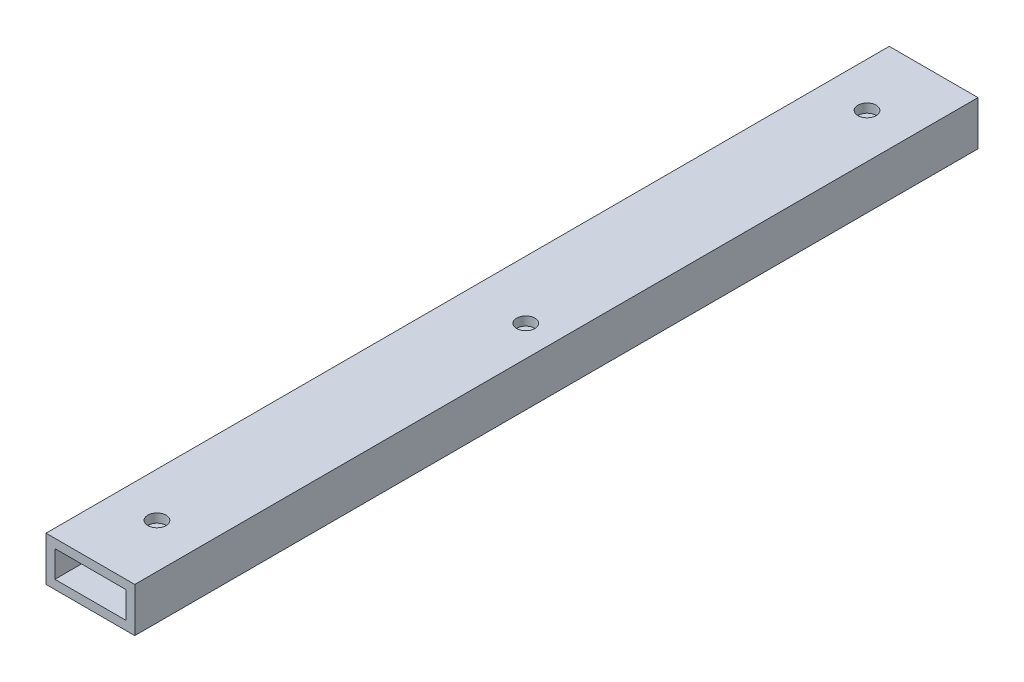
ISO-10303-21;
HEADER;
FILE_DESCRIPTION(('STEP AP214'),'2;1');
FILE_NAME('part.step','',(''),(''),'','','');
FILE_SCHEMA(('AUTOMOTIVE_DESIGN { 1 0 10303 214 1 1 1 1 }'));
ENDSEC;
DATA;
#1=APPLICATION_CONTEXT('core data for automotive mechanical design processes');
#2=APPLICATION_PROTOCOL_DEFINITION('international standard','automotive_design',2000,#1);
#3=PRODUCT_CONTEXT('',#1,'mechanical');
#4=PRODUCT('Part','Part','',(#3));
#5=PRODUCT_RELATED_PRODUCT_CATEGORY('part','',(#4));
#6=PRODUCT_DEFINITION_FORMATION('','',#4);
#7=PRODUCT_DEFINITION_CONTEXT('part definition',#1,'design');
#8=PRODUCT_DEFINITION('design','',#6,#7);
#9=PRODUCT_DEFINITION_SHAPE('','',#8);
#10=(LENGTH_UNIT() NAMED_UNIT(*) SI_UNIT(.MILLI.,.METRE.));
#11=(NAMED_UNIT(*) PLANE_ANGLE_UNIT() SI_UNIT($,.RADIAN.));
#12=(NAMED_UNIT(*) SI_UNIT($,.STERADIAN.) SOLID_ANGLE_UNIT());
#13=UNCERTAINTY_MEASURE_WITH_UNIT(LENGTH_MEASURE(1.E-05),#10,'distance_accuracy_value','');
#14=(GEOMETRIC_REPRESENTATION_CONTEXT(3) GLOBAL_UNCERTAINTY_ASSIGNED_CONTEXT((#13)) GLOBAL_UNIT_ASSIGNED_CONTEXT((#10,
#11,#12)) REPRESENTATION_CONTEXT('',''));
#15=CARTESIAN_POINT('',(0.,0.,0.));
#16=DIRECTION('',(0.,0.,1.));
#17=DIRECTION('',(1.,0.,0.));
#18=AXIS2_PLACEMENT_3D('',#15,#16,#17);
#19=CARTESIAN_POINT('',(0.,0.,95.));
#20=DIRECTION('',(0.,0.,1.));
#21=DIRECTION('',(1.,0.,0.));
#22=AXIS2_PLACEMENT_3D('',#19,#20,#21);
#23=PLANE('',#22);
#24=DIRECTION('',(0.,1.,0.));
#25=VECTOR('',#24,1.);
#26=CARTESIAN_POINT('',(10.0367537285158,5.03823934953629,95.));
#27=LINE('',#26,#25);
#28=CARTESIAN_POINT('',(10.0367537285158,-4.96176065046371,95.));
#29=VERTEX_POINT('',#28);
#30=CARTESIAN_POINT('',(10.0367537285158,5.03823934953629,95.));
#31=VERTEX_POINT('',#30);
#32=EDGE_CURVE('E146',#29,#31,#27,.T.);
#33=ORIENTED_EDGE('',*,*,#32,.T.);
#34=DIRECTION('',(-1.,0.,0.));
#35=VECTOR('',#34,1.);
#36=CARTESIAN_POINT('',(-9.96324627148418,5.03823934953629,95.));
#37=LINE('',#36,#35);
#38=CARTESIAN_POINT('',(-9.96324627148418,5.03823934953629,95.));
#39=VERTEX_POINT('',#38);
#40=EDGE_CURVE('E149',#31,#39,#37,.T.);
#41=ORIENTED_EDGE('',*,*,#40,.T.);
#42=DIRECTION('',(0.,-1.,0.));
#43=VECTOR('',#42,1.);
#44=CARTESIAN_POINT('',(-9.96324627148418,5.03823934953629,95.));
#45=LINE('',#44,#43);
#46=CARTESIAN_POINT('',(-9.96324627148418,-4.96176065046371,95.));
#47=VERTEX_POINT('',#46);
#48=EDGE_CURVE('E152',#39,#47,#45,.T.);
#49=ORIENTED_EDGE('',*,*,#48,.T.);
#50=DIRECTION('',(1.,0.,0.));
#51=VECTOR('',#50,1.);
#52=CARTESIAN_POINT('',(-9.96324627148418,-4.96176065046371,95.));
#53=LINE('',#52,#51);
#54=EDGE_CURVE('E154',#47,#29,#53,.T.);
#55=ORIENTED_EDGE('',*,*,#54,.T.);
#56=EDGE_LOOP('',(#33,#41,#49,#55));
#57=FACE_BOUND('',#56,.T.);
#58=DIRECTION('',(-1.,0.,0.));
#59=VECTOR('',#58,1.);
#60=CARTESIAN_POINT('',(-7.96324627148418,3.03823934953629,95.));
#61=LINE('',#60,#59);
#62=CARTESIAN_POINT('',(8.03675372851582,3.03823934953629,95.));
#63=VERTEX_POINT('',#62);
#64=CARTESIAN_POINT('',(-7.96324627148418,3.03823934953629,95.));
#65=VERTEX_POINT('',#64);
#66=EDGE_CURVE('E116',#63,#65,#61,.T.);
#67=ORIENTED_EDGE('',*,*,#66,.F.);
#68=DIRECTION('',(0.,1.,0.));
#69=VECTOR('',#68,1.);
#70=CARTESIAN_POINT('',(8.03675372851582,3.03823934953629,95.));
#71=LINE('',#70,#69);
#72=CARTESIAN_POINT('',(8.03675372851582,-2.96176065046371,95.));
#73=VERTEX_POINT('',#72);
#74=EDGE_CURVE('E108',#73,#63,#71,.T.);
#75=ORIENTED_EDGE('',*,*,#74,.F.);
#76=DIRECTION('',(1.,0.,0.));
#77=VECTOR('',#76,1.);
#78=CARTESIAN_POINT('',(-7.96324627148418,-2.96176065046371,95.));
#79=LINE('',#78,#77);
#80=CARTESIAN_POINT('',(-7.96324627148418,-2.96176065046371,95.));
#81=VERTEX_POINT('',#80);
#82=EDGE_CURVE('E130',#81,#73,#79,.T.);
#83=ORIENTED_EDGE('',*,*,#82,.F.);
#84=DIRECTION('',(0.,-1.,0.));
#85=VECTOR('',#84,1.);
#86=CARTESIAN_POINT('',(-7.96324627148418,3.03823934953629,95.));
#87=LINE('',#86,#85);
#88=EDGE_CURVE('E128',#65,#81,#87,.T.);
#89=ORIENTED_EDGE('',*,*,#88,.F.);
#90=EDGE_LOOP('',(#67,#75,#83,#89));
#91=FACE_BOUND('',#90,.T.);
#92=ADVANCED_FACE('F41',(#57,#91),#23,.T.);
#93=CARTESIAN_POINT('',(0.,0.,-95.));
#94=DIRECTION('',(0.,0.,1.));
#95=DIRECTION('',(1.,0.,0.));
#96=AXIS2_PLACEMENT_3D('',#93,#94,#95);
#97=PLANE('',#96);
#98=DIRECTION('',(0.,1.,0.));
#99=VECTOR('',#98,1.);
#100=CARTESIAN_POINT('',(10.0367537285158,5.03823934953629,-95.));
#101=LINE('',#100,#99);
#102=CARTESIAN_POINT('',(10.0367537285158,-4.96176065046371,-95.));
#103=VERTEX_POINT('',#102);
#104=CARTESIAN_POINT('',(10.0367537285158,5.03823934953629,-95.));
#105=VERTEX_POINT('',#104);
#106=EDGE_CURVE('E124',#103,#105,#101,.T.);
#107=ORIENTED_EDGE('',*,*,#106,.F.);
#108=DIRECTION('',(1.,0.,0.));
#109=VECTOR('',#108,1.);
#110=CARTESIAN_POINT('',(-9.96324627148418,-4.96176065046371,-95.));
#111=LINE('',#110,#109);
#112=CARTESIAN_POINT('',(-9.96324627148418,-4.96176065046371,-95.));
#113=VERTEX_POINT('',#112);
#114=EDGE_CURVE('E150',#113,#103,#111,.T.);
#115=ORIENTED_EDGE('',*,*,#114,.F.);
#116=DIRECTION('',(0.,-1.,0.));
#117=VECTOR('',#116,1.);
#118=CARTESIAN_POINT('',(-9.96324627148418,5.03823934953629,-95.));
#119=LINE('',#118,#117);
#120=CARTESIAN_POINT('',(-9.96324627148418,5.03823934953629,-95.));
#121=VERTEX_POINT('',#120);
#122=EDGE_CURVE('E161',#121,#113,#119,.T.);
#123=ORIENTED_EDGE('',*,*,#122,.F.);
#124=DIRECTION('',(-1.,0.,0.));
#125=VECTOR('',#124,1.);
#126=CARTESIAN_POINT('',(-9.96324627148418,5.03823934953629,-95.));
#127=LINE('',#126,#125);
#128=EDGE_CURVE('E159',#105,#121,#127,.T.);
#129=ORIENTED_EDGE('',*,*,#128,.F.);
#130=EDGE_LOOP('',(#107,#115,#123,#129));
#131=FACE_BOUND('',#130,.T.);
#132=DIRECTION('',(0.,1.,0.));
#133=VECTOR('',#132,1.);
#134=CARTESIAN_POINT('',(8.03675372851582,3.03823934953629,-95.));
#135=LINE('',#134,#133);
#136=CARTESIAN_POINT('',(8.03675372851582,-2.96176065046371,-95.));
#137=VERTEX_POINT('',#136);
#138=CARTESIAN_POINT('',(8.03675372851582,3.03823934953629,-95.));
#139=VERTEX_POINT('',#138);
#140=EDGE_CURVE('E66',#137,#139,#135,.T.);
#141=ORIENTED_EDGE('',*,*,#140,.T.);
#142=DIRECTION('',(-1.,0.,0.));
#143=VECTOR('',#142,1.);
#144=CARTESIAN_POINT('',(-7.96324627148418,3.03823934953629,-95.));
#145=LINE('',#144,#143);
#146=CARTESIAN_POINT('',(-7.96324627148418,3.03823934953629,-95.));
#147=VERTEX_POINT('',#146);
#148=EDGE_CURVE('E123',#139,#147,#145,.T.);
#149=ORIENTED_EDGE('',*,*,#148,.T.);
#150=DIRECTION('',(0.,-1.,0.));
#151=VECTOR('',#150,1.);
#152=CARTESIAN_POINT('',(-7.96324627148418,3.03823934953629,-95.));
#153=LINE('',#152,#151);
#154=CARTESIAN_POINT('',(-7.96324627148418,-2.96176065046371,-95.));
#155=VERTEX_POINT('',#154);
#156=EDGE_CURVE('E138',#147,#155,#153,.T.);
#157=ORIENTED_EDGE('',*,*,#156,.T.);
#158=DIRECTION('',(1.,0.,0.));
#159=VECTOR('',#158,1.);
#160=CARTESIAN_POINT('',(-7.96324627148418,-2.96176065046371,-95.));
#161=LINE('',#160,#159);
#162=EDGE_CURVE('E117',#155,#137,#161,.T.);
#163=ORIENTED_EDGE('',*,*,#162,.T.);
#164=EDGE_LOOP('',(#141,#149,#157,#163));
#165=FACE_BOUND('',#164,.T.);
#166=ADVANCED_FACE('F208',(#131,#165),#97,.F.);
#167=CARTESIAN_POINT('',(10.0367537285158,5.03823934953629,95.));
#168=DIRECTION('',(-1.,0.,0.));
#169=DIRECTION('',(0.,0.,1.));
#170=AXIS2_PLACEMENT_3D('',#167,#168,#169);
#171=PLANE('',#170);
#172=ORIENTED_EDGE('',*,*,#106,.T.);
#173=DIRECTION('',(0.,0.,-1.));
#174=VECTOR('',#173,1.);
#175=CARTESIAN_POINT('',(10.0367537285158,5.03823934953629,95.));
#176=LINE('',#175,#174);
#177=EDGE_CURVE('E11',#31,#105,#176,.T.);
#178=ORIENTED_EDGE('',*,*,#177,.F.);
#179=ORIENTED_EDGE('',*,*,#32,.F.);
#180=DIRECTION('',(0.,0.,-1.));
#181=VECTOR('',#180,1.);
#182=CARTESIAN_POINT('',(10.0367537285158,-4.96176065046371,95.));
#183=LINE('',#182,#181);
#184=EDGE_CURVE('E156',#29,#103,#183,.T.);
#185=ORIENTED_EDGE('',*,*,#184,.T.);
#186=EDGE_LOOP('',(#172,#178,#179,#185));
#187=FACE_BOUND('',#186,.T.);
#188=ADVANCED_FACE('F43',(#187),#171,.F.);
#189=CARTESIAN_POINT('',(-9.96324627148418,5.03823934953629,95.));
#190=DIRECTION('',(0.,-1.,0.));
#191=DIRECTION('',(0.,0.,-1.));
#192=AXIS2_PLACEMENT_3D('',#189,#190,#191);
#193=PLANE('',#192);
#194=CARTESIAN_POINT('',(0.0367537285158176,5.03823934953629,80.));
#195=DIRECTION('',(0.,1.,0.));
#196=DIRECTION('',(0.,0.,-1.));
#197=AXIS2_PLACEMENT_3D('',#194,#195,#196);
#198=CIRCLE('',#197,2.05);
#199=CARTESIAN_POINT('',(0.0367537285158176,5.03823934953629,77.95));
#200=VERTEX_POINT('',#199);
#201=EDGE_CURVE('E245',#200,#200,#198,.T.);
#202=ORIENTED_EDGE('',*,*,#201,.F.);
#203=EDGE_LOOP('',(#202));
#204=FACE_BOUND('',#203,.T.);
#205=CARTESIAN_POINT('',(0.0367537285158176,5.03823934953629,-80.));
#206=DIRECTION('',(0.,1.,0.));
#207=DIRECTION('',(0.,0.,1.));
#208=AXIS2_PLACEMENT_3D('',#205,#206,#207);
#209=CIRCLE('',#208,2.05);
#210=CARTESIAN_POINT('',(0.0367537285158176,5.03823934953629,-77.95));
#211=VERTEX_POINT('',#210);
#212=EDGE_CURVE('E249',#211,#211,#209,.T.);
#213=ORIENTED_EDGE('',*,*,#212,.F.);
#214=EDGE_LOOP('',(#213));
#215=FACE_BOUND('',#214,.T.);
#216=CARTESIAN_POINT('',(3.13675372851582,5.03823934953629,0.));
#217=DIRECTION('',(0.,1.,0.));
#218=DIRECTION('',(0.,0.,1.));
#219=AXIS2_PLACEMENT_3D('',#216,#217,#218);
#220=CIRCLE('',#219,2.05);
#221=CARTESIAN_POINT('',(3.13675372851582,5.03823934953629,2.05));
#222=VERTEX_POINT('',#221);
#223=EDGE_CURVE('E187',#222,#222,#220,.T.);
#224=ORIENTED_EDGE('',*,*,#223,.F.);
#225=EDGE_LOOP('',(#224));
#226=FACE_BOUND('',#225,.T.);
#227=ORIENTED_EDGE('',*,*,#128,.T.);
#228=DIRECTION('',(0.,0.,-1.));
#229=VECTOR('',#228,1.);
#230=CARTESIAN_POINT('',(-9.96324627148418,5.03823934953629,95.));
#231=LINE('',#230,#229);
#232=EDGE_CURVE('E50',#39,#121,#231,.T.);
#233=ORIENTED_EDGE('',*,*,#232,.F.);
#234=ORIENTED_EDGE('',*,*,#40,.F.);
#235=ORIENTED_EDGE('',*,*,#177,.T.);
#236=EDGE_LOOP('',(#227,#233,#234,#235));
#237=FACE_BOUND('',#236,.T.);
#238=ADVANCED_FACE('F235',(#204,#215,#226,#237),#193,.F.);
#239=CARTESIAN_POINT('',(-9.96324627148418,5.03823934953629,95.));
#240=DIRECTION('',(1.,0.,0.));
#241=DIRECTION('',(0.,0.,-1.));
#242=AXIS2_PLACEMENT_3D('',#239,#240,#241);
#243=PLANE('',#242);
#244=ORIENTED_EDGE('',*,*,#122,.T.);
#245=DIRECTION('',(0.,0.,-1.));
#246=VECTOR('',#245,1.);
#247=CARTESIAN_POINT('',(-9.96324627148418,-4.96176065046371,95.));
#248=LINE('',#247,#246);
#249=EDGE_CURVE('E166',#47,#113,#248,.T.);
#250=ORIENTED_EDGE('',*,*,#249,.F.);
#251=ORIENTED_EDGE('',*,*,#48,.F.);
#252=ORIENTED_EDGE('',*,*,#232,.T.);
#253=EDGE_LOOP('',(#244,#250,#251,#252));
#254=FACE_BOUND('',#253,.T.);
#255=ADVANCED_FACE('F232',(#254),#243,.F.);
#256=CARTESIAN_POINT('',(-9.96324627148418,-4.96176065046371,95.));
#257=DIRECTION('',(0.,1.,0.));
#258=DIRECTION('',(-1.,0.,0.));
#259=AXIS2_PLACEMENT_3D('',#256,#257,#258);
#260=PLANE('',#259);
#261=CARTESIAN_POINT('',(0.0367537285158176,-4.96176065046371,80.));
#262=DIRECTION('',(0.,1.,0.));
#263=DIRECTION('',(0.,0.,-1.));
#264=AXIS2_PLACEMENT_3D('',#261,#262,#263);
#265=CIRCLE('',#264,2.05);
#266=CARTESIAN_POINT('',(0.0367537285158176,-4.96176065046371,77.95));
#267=VERTEX_POINT('',#266);
#268=EDGE_CURVE('E273',#267,#267,#265,.T.);
#269=ORIENTED_EDGE('',*,*,#268,.T.);
#270=EDGE_LOOP('',(#269));
#271=FACE_BOUND('',#270,.T.);
#272=CARTESIAN_POINT('',(0.0367537285158176,-4.96176065046371,-80.));
#273=DIRECTION('',(0.,1.,0.));
#274=DIRECTION('',(0.,0.,1.));
#275=AXIS2_PLACEMENT_3D('',#272,#273,#274);
#276=CIRCLE('',#275,2.05);
#277=CARTESIAN_POINT('',(0.0367537285158176,-4.96176065046371,-77.95));
#278=VERTEX_POINT('',#277);
#279=EDGE_CURVE('E266',#278,#278,#276,.T.);
#280=ORIENTED_EDGE('',*,*,#279,.T.);
#281=EDGE_LOOP('',(#280));
#282=FACE_BOUND('',#281,.T.);
#283=CARTESIAN_POINT('',(3.13675372851582,-4.96176065046371,0.));
#284=DIRECTION('',(0.,1.,0.));
#285=DIRECTION('',(0.,0.,1.));
#286=AXIS2_PLACEMENT_3D('',#283,#284,#285);
#287=CIRCLE('',#286,2.05);
#288=CARTESIAN_POINT('',(3.13675372851582,-4.96176065046371,2.05));
#289=VERTEX_POINT('',#288);
#290=EDGE_CURVE('E174',#289,#289,#287,.T.);
#291=ORIENTED_EDGE('',*,*,#290,.T.);
#292=EDGE_LOOP('',(#291));
#293=FACE_BOUND('',#292,.T.);
#294=ORIENTED_EDGE('',*,*,#114,.T.);
#295=ORIENTED_EDGE('',*,*,#184,.F.);
#296=ORIENTED_EDGE('',*,*,#54,.F.);
#297=ORIENTED_EDGE('',*,*,#249,.T.);
#298=EDGE_LOOP('',(#294,#295,#296,#297));
#299=FACE_BOUND('',#298,.T.);
#300=ADVANCED_FACE('F229',(#271,#282,#293,#299),#260,.F.);
#301=CARTESIAN_POINT('',(8.03675372851582,3.03823934953629,95.));
#302=DIRECTION('',(-1.,0.,0.));
#303=DIRECTION('',(0.,0.,1.));
#304=AXIS2_PLACEMENT_3D('',#301,#302,#303);
#305=PLANE('',#304);
#306=ORIENTED_EDGE('',*,*,#140,.F.);
#307=DIRECTION('',(0.,0.,-1.));
#308=VECTOR('',#307,1.);
#309=CARTESIAN_POINT('',(8.03675372851582,-2.96176065046371,95.));
#310=LINE('',#309,#308);
#311=EDGE_CURVE('E112',#73,#137,#310,.T.);
#312=ORIENTED_EDGE('',*,*,#311,.F.);
#313=ORIENTED_EDGE('',*,*,#74,.T.);
#314=DIRECTION('',(0.,0.,-1.));
#315=VECTOR('',#314,1.);
#316=CARTESIAN_POINT('',(8.03675372851582,3.03823934953629,95.));
#317=LINE('',#316,#315);
#318=EDGE_CURVE('E111',#63,#139,#317,.T.);
#319=ORIENTED_EDGE('',*,*,#318,.T.);
#320=EDGE_LOOP('',(#306,#312,#313,#319));
#321=FACE_BOUND('',#320,.T.);
#322=ADVANCED_FACE('F110',(#321),#305,.T.);
#323=CARTESIAN_POINT('',(-7.96324627148418,3.03823934953629,95.));
#324=DIRECTION('',(0.,-1.,0.));
#325=DIRECTION('',(0.,0.,-1.));
#326=AXIS2_PLACEMENT_3D('',#323,#324,#325);
#327=PLANE('',#326);
#328=CARTESIAN_POINT('',(0.0367537285158176,3.03823934953629,80.));
#329=DIRECTION('',(0.,-1.,0.));
#330=DIRECTION('',(0.,0.,-1.));
#331=AXIS2_PLACEMENT_3D('',#328,#329,#330);
#332=CIRCLE('',#331,2.05);
#333=CARTESIAN_POINT('',(0.0367537285158176,3.03823934953629,77.95));
#334=VERTEX_POINT('',#333);
#335=EDGE_CURVE('E136',#334,#334,#332,.T.);
#336=ORIENTED_EDGE('',*,*,#335,.F.);
#337=EDGE_LOOP('',(#336));
#338=FACE_BOUND('',#337,.T.);
#339=CARTESIAN_POINT('',(0.0367537285158176,3.03823934953629,-80.));
#340=DIRECTION('',(0.,-1.,0.));
#341=DIRECTION('',(0.,0.,-1.));
#342=AXIS2_PLACEMENT_3D('',#339,#340,#341);
#343=CIRCLE('',#342,2.05);
#344=CARTESIAN_POINT('',(0.0367537285158176,3.03823934953629,-82.05));
#345=VERTEX_POINT('',#344);
#346=EDGE_CURVE('E177',#345,#345,#343,.T.);
#347=ORIENTED_EDGE('',*,*,#346,.F.);
#348=EDGE_LOOP('',(#347));
#349=FACE_BOUND('',#348,.T.);
#350=CARTESIAN_POINT('',(3.13675372851582,3.03823934953629,0.));
#351=DIRECTION('',(0.,-1.,0.));
#352=DIRECTION('',(0.,0.,-1.));
#353=AXIS2_PLACEMENT_3D('',#350,#351,#352);
#354=CIRCLE('',#353,2.05);
#355=CARTESIAN_POINT('',(3.13675372851582,3.03823934953629,-2.05));
#356=VERTEX_POINT('',#355);
#357=EDGE_CURVE('E173',#356,#356,#354,.T.);
#358=ORIENTED_EDGE('',*,*,#357,.F.);
#359=EDGE_LOOP('',(#358));
#360=FACE_BOUND('',#359,.T.);
#361=ORIENTED_EDGE('',*,*,#148,.F.);
#362=ORIENTED_EDGE('',*,*,#318,.F.);
#363=ORIENTED_EDGE('',*,*,#66,.T.);
#364=DIRECTION('',(0.,0.,-1.));
#365=VECTOR('',#364,1.);
#366=CARTESIAN_POINT('',(-7.96324627148418,3.03823934953629,95.));
#367=LINE('',#366,#365);
#368=EDGE_CURVE('E125',#65,#147,#367,.T.);
#369=ORIENTED_EDGE('',*,*,#368,.T.);
#370=EDGE_LOOP('',(#361,#362,#363,#369));
#371=FACE_BOUND('',#370,.T.);
#372=ADVANCED_FACE('F120',(#338,#349,#360,#371),#327,.T.);
#373=CARTESIAN_POINT('',(-7.96324627148418,3.03823934953629,95.));
#374=DIRECTION('',(1.,0.,0.));
#375=DIRECTION('',(0.,0.,-1.));
#376=AXIS2_PLACEMENT_3D('',#373,#374,#375);
#377=PLANE('',#376);
#378=ORIENTED_EDGE('',*,*,#156,.F.);
#379=ORIENTED_EDGE('',*,*,#368,.F.);
#380=ORIENTED_EDGE('',*,*,#88,.T.);
#381=DIRECTION('',(0.,0.,-1.));
#382=VECTOR('',#381,1.);
#383=CARTESIAN_POINT('',(-7.96324627148418,-2.96176065046371,95.));
#384=LINE('',#383,#382);
#385=EDGE_CURVE('E58',#81,#155,#384,.T.);
#386=ORIENTED_EDGE('',*,*,#385,.T.);
#387=EDGE_LOOP('',(#378,#379,#380,#386));
#388=FACE_BOUND('',#387,.T.);
#389=ADVANCED_FACE('F202',(#388),#377,.T.);
#390=CARTESIAN_POINT('',(-7.96324627148418,-2.96176065046371,95.));
#391=DIRECTION('',(0.,1.,0.));
#392=DIRECTION('',(0.,0.,1.));
#393=AXIS2_PLACEMENT_3D('',#390,#391,#392);
#394=PLANE('',#393);
#395=CARTESIAN_POINT('',(0.0367537285158176,-2.96176065046371,80.));
#396=DIRECTION('',(0.,1.,0.));
#397=DIRECTION('',(0.,0.,1.));
#398=AXIS2_PLACEMENT_3D('',#395,#396,#397);
#399=CIRCLE('',#398,2.05);
#400=CARTESIAN_POINT('',(0.0367537285158176,-2.96176065046371,82.05));
#401=VERTEX_POINT('',#400);
#402=EDGE_CURVE('E45',#401,#401,#399,.T.);
#403=ORIENTED_EDGE('',*,*,#402,.F.);
#404=EDGE_LOOP('',(#403));
#405=FACE_BOUND('',#404,.T.);
#406=CARTESIAN_POINT('',(0.0367537285158176,-2.96176065046371,-80.));
#407=DIRECTION('',(0.,1.,0.));
#408=DIRECTION('',(0.,0.,1.));
#409=AXIS2_PLACEMENT_3D('',#406,#407,#408);
#410=CIRCLE('',#409,2.05);
#411=CARTESIAN_POINT('',(0.0367537285158176,-2.96176065046371,-77.95));
#412=VERTEX_POINT('',#411);
#413=EDGE_CURVE('E175',#412,#412,#410,.T.);
#414=ORIENTED_EDGE('',*,*,#413,.F.);
#415=EDGE_LOOP('',(#414));
#416=FACE_BOUND('',#415,.T.);
#417=CARTESIAN_POINT('',(3.13675372851582,-2.96176065046371,0.));
#418=DIRECTION('',(0.,1.,0.));
#419=DIRECTION('',(0.,0.,1.));
#420=AXIS2_PLACEMENT_3D('',#417,#418,#419);
#421=CIRCLE('',#420,2.05);
#422=CARTESIAN_POINT('',(3.13675372851582,-2.96176065046371,2.05));
#423=VERTEX_POINT('',#422);
#424=EDGE_CURVE('E171',#423,#423,#421,.T.);
#425=ORIENTED_EDGE('',*,*,#424,.F.);
#426=EDGE_LOOP('',(#425));
#427=FACE_BOUND('',#426,.T.);
#428=ORIENTED_EDGE('',*,*,#162,.F.);
#429=ORIENTED_EDGE('',*,*,#385,.F.);
#430=ORIENTED_EDGE('',*,*,#82,.T.);
#431=ORIENTED_EDGE('',*,*,#311,.T.);
#432=EDGE_LOOP('',(#428,#429,#430,#431));
#433=FACE_BOUND('',#432,.T.);
#434=ADVANCED_FACE('F198',(#405,#416,#427,#433),#394,.T.);
#435=CARTESIAN_POINT('',(3.13675372851582,-4.96176065046371,0.));
#436=DIRECTION('',(0.,1.,0.));
#437=DIRECTION('',(0.,0.,1.));
#438=AXIS2_PLACEMENT_3D('',#435,#436,#437);
#439=CYLINDRICAL_SURFACE('',#438,2.05);
#440=ORIENTED_EDGE('',*,*,#424,.T.);
#441=EDGE_LOOP('',(#440));
#442=FACE_BOUND('',#441,.T.);
#443=ORIENTED_EDGE('',*,*,#290,.F.);
#444=EDGE_LOOP('',(#443));
#445=FACE_BOUND('',#444,.T.);
#446=ADVANCED_FACE('F201',(#442,#445),#439,.F.);
#447=CARTESIAN_POINT('',(0.0367537285158176,-4.96176065046371,-80.));
#448=DIRECTION('',(0.,1.,0.));
#449=DIRECTION('',(0.,0.,1.));
#450=AXIS2_PLACEMENT_3D('',#447,#448,#449);
#451=CYLINDRICAL_SURFACE('',#450,2.05);
#452=ORIENTED_EDGE('',*,*,#413,.T.);
#453=EDGE_LOOP('',(#452));
#454=FACE_BOUND('',#453,.T.);
#455=ORIENTED_EDGE('',*,*,#279,.F.);
#456=EDGE_LOOP('',(#455));
#457=FACE_BOUND('',#456,.T.);
#458=ADVANCED_FACE('F279',(#454,#457),#451,.F.);
#459=CARTESIAN_POINT('',(0.0367537285158176,-4.96176065046371,80.));
#460=DIRECTION('',(0.,1.,0.));
#461=DIRECTION('',(0.,0.,1.));
#462=AXIS2_PLACEMENT_3D('',#459,#460,#461);
#463=CYLINDRICAL_SURFACE('',#462,2.05);
#464=ORIENTED_EDGE('',*,*,#402,.T.);
#465=EDGE_LOOP('',(#464));
#466=FACE_BOUND('',#465,.T.);
#467=ORIENTED_EDGE('',*,*,#268,.F.);
#468=EDGE_LOOP('',(#467));
#469=FACE_BOUND('',#468,.T.);
#470=ADVANCED_FACE('F195',(#466,#469),#463,.F.);
#471=ORIENTED_EDGE('',*,*,#357,.T.);
#472=EDGE_LOOP('',(#471));
#473=FACE_BOUND('',#472,.T.);
#474=ORIENTED_EDGE('',*,*,#223,.T.);
#475=EDGE_LOOP('',(#474));
#476=FACE_BOUND('',#475,.T.);
#477=ADVANCED_FACE('F278',(#473,#476),#439,.F.);
#478=ORIENTED_EDGE('',*,*,#346,.T.);
#479=EDGE_LOOP('',(#478));
#480=FACE_BOUND('',#479,.T.);
#481=ORIENTED_EDGE('',*,*,#212,.T.);
#482=EDGE_LOOP('',(#481));
#483=FACE_BOUND('',#482,.T.);
#484=ADVANCED_FACE('F286',(#480,#483),#451,.F.);
#485=ORIENTED_EDGE('',*,*,#335,.T.);
#486=EDGE_LOOP('',(#485));
#487=FACE_BOUND('',#486,.T.);
#488=ORIENTED_EDGE('',*,*,#201,.T.);
#489=EDGE_LOOP('',(#488));
#490=FACE_BOUND('',#489,.T.);
#491=ADVANCED_FACE('F281',(#487,#490),#463,.F.);
#492=CLOSED_SHELL('',(#92,#166,#188,#238,#255,#300,#322,#372,#389,#434,#446,#458,#470,#477,#484,#491));
#493=MANIFOLD_SOLID_BREP('B2',#492);
#494=ADVANCED_BREP_SHAPE_REPRESENTATION('',(#18,#493),#14);
#495=SHAPE_DEFINITION_REPRESENTATION(#9,#494);
ENDSEC;
END-ISO-10303-21;
